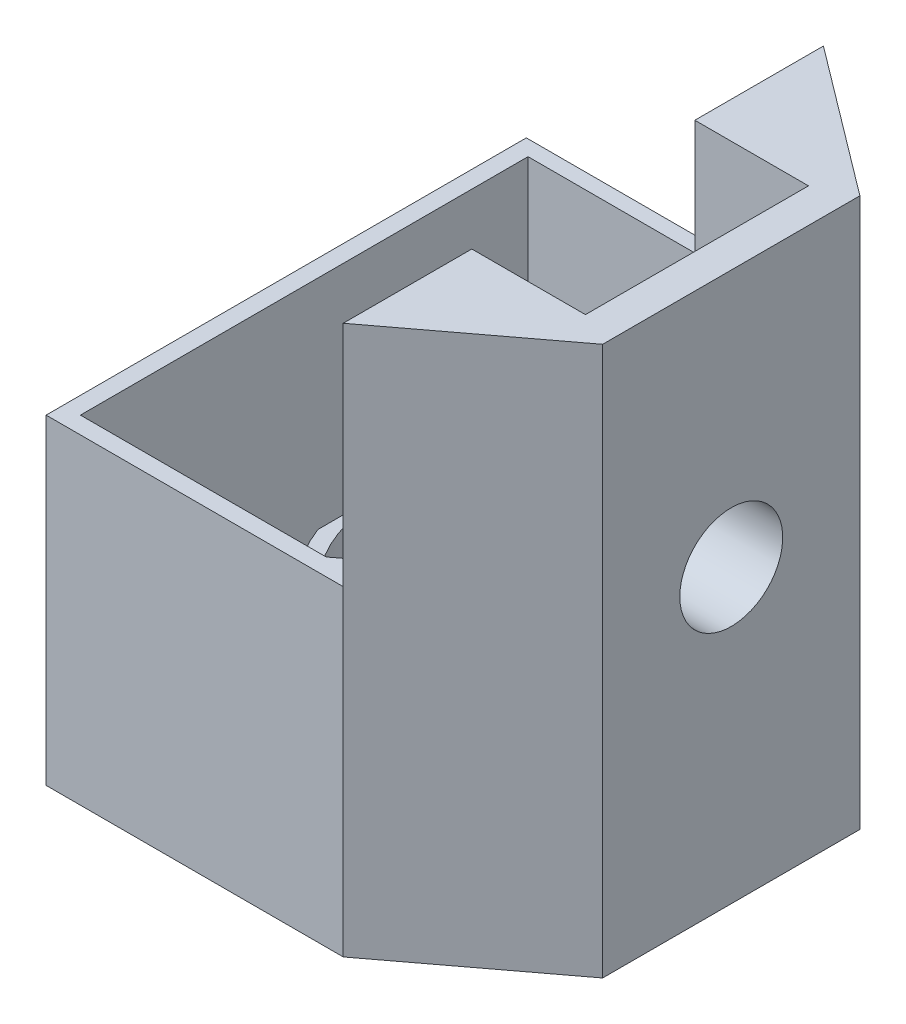
ISO-10303-21;
HEADER;
FILE_DESCRIPTION(('STEP AP214'),'2;1');
FILE_NAME('part.step','',(''),(''),'','','');
FILE_SCHEMA(('AUTOMOTIVE_DESIGN { 1 0 10303 214 1 1 1 1 }'));
ENDSEC;
DATA;
#1=APPLICATION_CONTEXT('core data for automotive mechanical design processes');
#2=APPLICATION_PROTOCOL_DEFINITION('international standard','automotive_design',2000,#1);
#3=PRODUCT_CONTEXT('',#1,'mechanical');
#4=PRODUCT('Part','Part','',(#3));
#5=PRODUCT_RELATED_PRODUCT_CATEGORY('part','',(#4));
#6=PRODUCT_DEFINITION_FORMATION('','',#4);
#7=PRODUCT_DEFINITION_CONTEXT('part definition',#1,'design');
#8=PRODUCT_DEFINITION('design','',#6,#7);
#9=PRODUCT_DEFINITION_SHAPE('','',#8);
#10=(LENGTH_UNIT() NAMED_UNIT(*) SI_UNIT(.MILLI.,.METRE.));
#11=(NAMED_UNIT(*) PLANE_ANGLE_UNIT() SI_UNIT($,.RADIAN.));
#12=(NAMED_UNIT(*) SI_UNIT($,.STERADIAN.) SOLID_ANGLE_UNIT());
#13=UNCERTAINTY_MEASURE_WITH_UNIT(LENGTH_MEASURE(1.E-05),#10,'distance_accuracy_value','');
#14=(GEOMETRIC_REPRESENTATION_CONTEXT(3) GLOBAL_UNCERTAINTY_ASSIGNED_CONTEXT((#13)) GLOBAL_UNIT_ASSIGNED_CONTEXT((#10,
#11,#12)) REPRESENTATION_CONTEXT('',''));
#15=CARTESIAN_POINT('',(0.,0.,0.));
#16=DIRECTION('',(0.,0.,1.));
#17=DIRECTION('',(1.,0.,0.));
#18=AXIS2_PLACEMENT_3D('',#15,#16,#17);
#19=CARTESIAN_POINT('',(0.,-15.,-6.50283678389311));
#20=DIRECTION('',(-0.601815023152049,0.,0.798635510047292));
#21=DIRECTION('',(0.798635510047292,0.,0.601815023152049));
#22=AXIS2_PLACEMENT_3D('',#19,#20,#21);
#23=PLANE('',#22);
#24=DIRECTION('',(0.,1.,0.));
#25=VECTOR('',#24,1.);
#26=CARTESIAN_POINT('',(0.,-15.,-6.50283678389311));
#27=LINE('',#26,#25);
#28=CARTESIAN_POINT('',(0.,-15.,-6.50283678389311));
#29=VERTEX_POINT('',#28);
#30=CARTESIAN_POINT('',(0.,1.69999999999999,-6.50283678389311));
#31=VERTEX_POINT('',#30);
#32=EDGE_CURVE('E376',#29,#31,#27,.T.);
#33=ORIENTED_EDGE('',*,*,#32,.T.);
#34=DIRECTION('',(-0.798635510047292,0.,-0.601815023152049));
#35=VECTOR('',#34,1.);
#36=CARTESIAN_POINT('',(0.,1.69999999999999,-6.50283678389311));
#37=LINE('',#36,#35);
#38=CARTESIAN_POINT('',(-6.62579134053264,1.69999999999999,-11.4957286836875));
#39=VERTEX_POINT('',#38);
#40=EDGE_CURVE('E240',#31,#39,#37,.T.);
#41=ORIENTED_EDGE('',*,*,#40,.T.);
#42=DIRECTION('',(0.798635510047292,0.,0.601815023152049));
#43=VECTOR('',#42,1.);
#44=CARTESIAN_POINT('',(0.,1.69999999999999,-6.50283678389311));
#45=LINE('',#44,#43);
#46=CARTESIAN_POINT('',(-8.75473128331924,1.69999999999999,-13.1));
#47=VERTEX_POINT('',#46);
#48=EDGE_CURVE('E294',#47,#39,#45,.T.);
#49=ORIENTED_EDGE('',*,*,#48,.F.);
#50=DIRECTION('',(0.,-1.,0.));
#51=VECTOR('',#50,1.);
#52=CARTESIAN_POINT('',(-8.75473128331924,-15.,-13.1));
#53=LINE('',#52,#51);
#54=CARTESIAN_POINT('',(-8.75473128331924,-15.,-13.1));
#55=VERTEX_POINT('',#54);
#56=EDGE_CURVE('E317',#47,#55,#53,.T.);
#57=ORIENTED_EDGE('',*,*,#56,.T.);
#58=DIRECTION('',(0.798635510047292,0.,0.601815023152049));
#59=VECTOR('',#58,1.);
#60=CARTESIAN_POINT('',(0.,-15.,-6.50283678389311));
#61=LINE('',#60,#59);
#62=EDGE_CURVE('E372',#55,#29,#61,.T.);
#63=ORIENTED_EDGE('',*,*,#62,.T.);
#64=EDGE_LOOP('',(#33,#41,#49,#57,#63));
#65=FACE_BOUND('',#64,.T.);
#66=ADVANCED_FACE('F33',(#65),#23,.T.);
#67=CARTESIAN_POINT('',(0.,-15.,6.50283678389311));
#68=DIRECTION('',(-0.601815023152049,0.,-0.798635510047292));
#69=DIRECTION('',(-0.798635510047292,0.,0.601815023152049));
#70=AXIS2_PLACEMENT_3D('',#67,#68,#69);
#71=PLANE('',#70);
#72=DIRECTION('',(-0.798635510047292,0.,0.601815023152049));
#73=VECTOR('',#72,1.);
#74=CARTESIAN_POINT('',(0.,1.69999999999999,6.50283678389311));
#75=LINE('',#74,#73);
#76=CARTESIAN_POINT('',(0.,1.69999999999998,6.50283678389311));
#77=VERTEX_POINT('',#76);
#78=CARTESIAN_POINT('',(-6.62579134053264,1.69999999999998,11.4957286836875));
#79=VERTEX_POINT('',#78);
#80=EDGE_CURVE('E254',#77,#79,#75,.T.);
#81=ORIENTED_EDGE('',*,*,#80,.F.);
#82=DIRECTION('',(0.,1.,0.));
#83=VECTOR('',#82,1.);
#84=CARTESIAN_POINT('',(0.,-15.,6.50283678389311));
#85=LINE('',#84,#83);
#86=CARTESIAN_POINT('',(0.,-15.,6.50283678389311));
#87=VERTEX_POINT('',#86);
#88=EDGE_CURVE('E364',#87,#77,#85,.T.);
#89=ORIENTED_EDGE('',*,*,#88,.F.);
#90=DIRECTION('',(-0.798635510047292,0.,0.601815023152049));
#91=VECTOR('',#90,1.);
#92=CARTESIAN_POINT('',(0.,-15.,6.50283678389311));
#93=LINE('',#92,#91);
#94=CARTESIAN_POINT('',(-8.62202680115719,-15.,13.));
#95=VERTEX_POINT('',#94);
#96=EDGE_CURVE('E361',#87,#95,#93,.T.);
#97=ORIENTED_EDGE('',*,*,#96,.T.);
#98=DIRECTION('',(0.,1.,0.));
#99=VECTOR('',#98,1.);
#100=CARTESIAN_POINT('',(-8.62202680115719,-15.,13.));
#101=LINE('',#100,#99);
#102=CARTESIAN_POINT('',(-8.62202680115719,1.69999999999999,13.));
#103=VERTEX_POINT('',#102);
#104=EDGE_CURVE('E319',#95,#103,#101,.T.);
#105=ORIENTED_EDGE('',*,*,#104,.T.);
#106=DIRECTION('',(-0.798635510047292,0.,0.601815023152049));
#107=VECTOR('',#106,1.);
#108=CARTESIAN_POINT('',(0.,1.69999999999999,6.50283678389311));
#109=LINE('',#108,#107);
#110=EDGE_CURVE('E292',#79,#103,#109,.T.);
#111=ORIENTED_EDGE('',*,*,#110,.F.);
#112=EDGE_LOOP('',(#81,#89,#97,#105,#111));
#113=FACE_BOUND('',#112,.T.);
#114=ADVANCED_FACE('F460',(#113),#71,.T.);
#115=CARTESIAN_POINT('',(0.,-15.,0.));
#116=DIRECTION('',(0.,-1.,0.));
#117=DIRECTION('',(0.,0.,-1.));
#118=AXIS2_PLACEMENT_3D('',#115,#116,#117);
#119=PLANE('',#118);
#120=DIRECTION('',(-1.,0.,0.));
#121=VECTOR('',#120,1.);
#122=CARTESIAN_POINT('',(-19.9490716227776,-15.,12.));
#123=LINE('',#122,#121);
#124=CARTESIAN_POINT('',(-9.94907162277759,-15.,12.));
#125=VERTEX_POINT('',#124);
#126=CARTESIAN_POINT('',(-19.9490716227776,-15.,12.));
#127=VERTEX_POINT('',#126);
#128=EDGE_CURVE('E208',#125,#127,#123,.T.);
#129=ORIENTED_EDGE('',*,*,#128,.T.);
#130=DIRECTION('',(0.,0.,-1.));
#131=VECTOR('',#130,1.);
#132=CARTESIAN_POINT('',(-19.9490716227776,-15.,12.));
#133=LINE('',#132,#131);
#134=CARTESIAN_POINT('',(-19.9490716227776,-15.,6.99999999999997));
#135=VERTEX_POINT('',#134);
#136=EDGE_CURVE('E202',#127,#135,#133,.T.);
#137=ORIENTED_EDGE('',*,*,#136,.T.);
#138=DIRECTION('',(1.,0.,0.));
#139=VECTOR('',#138,1.);
#140=CARTESIAN_POINT('',(-19.9490716227776,-15.,6.99999999999997));
#141=LINE('',#140,#139);
#142=CARTESIAN_POINT('',(-9.94907162277759,-15.,6.99999999999997));
#143=VERTEX_POINT('',#142);
#144=EDGE_CURVE('E211',#135,#143,#141,.T.);
#145=ORIENTED_EDGE('',*,*,#144,.T.);
#146=DIRECTION('',(0.,0.,1.));
#147=VECTOR('',#146,1.);
#148=CARTESIAN_POINT('',(-9.94907162277759,-15.,12.));
#149=LINE('',#148,#147);
#150=EDGE_CURVE('E48',#143,#125,#149,.T.);
#151=ORIENTED_EDGE('',*,*,#150,.T.);
#152=EDGE_LOOP('',(#129,#137,#145,#151));
#153=FACE_BOUND('',#152,.T.);
#154=DIRECTION('',(1.,0.,0.));
#155=VECTOR('',#154,1.);
#156=CARTESIAN_POINT('',(-6.62579134053264,-15.,-13.1));
#157=LINE('',#156,#155);
#158=CARTESIAN_POINT('',(-9.86910560364314,-15.,-13.1));
#159=VERTEX_POINT('',#158);
#160=EDGE_CURVE('E304',#159,#55,#157,.T.);
#161=ORIENTED_EDGE('',*,*,#160,.F.);
#162=CARTESIAN_POINT('',(-13.8841109013204,-15.,-4.27950229380476));
#163=DIRECTION('',(0.,-1.,0.));
#164=DIRECTION('',(0.,0.,-1.));
#165=AXIS2_PLACEMENT_3D('',#162,#163,#164);
#166=CIRCLE('',#165,9.69130782326983);
#167=CARTESIAN_POINT('',(-22.9490716227776,-15.,-0.851976299182919));
#168=VERTEX_POINT('',#167);
#169=EDGE_CURVE('E402',#168,#159,#166,.F.);
#170=ORIENTED_EDGE('',*,*,#169,.F.);
#171=DIRECTION('',(0.,0.,-1.));
#172=VECTOR('',#171,1.);
#173=CARTESIAN_POINT('',(-22.9490716227776,-15.,13.));
#174=LINE('',#173,#172);
#175=CARTESIAN_POINT('',(-22.9490716227776,-15.,13.));
#176=VERTEX_POINT('',#175);
#177=EDGE_CURVE('E301',#176,#168,#174,.T.);
#178=ORIENTED_EDGE('',*,*,#177,.F.);
#179=DIRECTION('',(-1.,0.,0.));
#180=VECTOR('',#179,1.);
#181=CARTESIAN_POINT('',(-22.9490716227776,-15.,13.));
#182=LINE('',#181,#180);
#183=EDGE_CURVE('E297',#95,#176,#182,.T.);
#184=ORIENTED_EDGE('',*,*,#183,.F.);
#185=ORIENTED_EDGE('',*,*,#96,.F.);
#186=DIRECTION('',(0.,0.,-1.));
#187=VECTOR('',#186,1.);
#188=CARTESIAN_POINT('',(0.,-15.,10.));
#189=LINE('',#188,#187);
#190=EDGE_CURVE('E390',#87,#29,#189,.T.);
#191=ORIENTED_EDGE('',*,*,#190,.T.);
#192=ORIENTED_EDGE('',*,*,#62,.F.);
#193=EDGE_LOOP('',(#161,#170,#178,#184,#185,#191,#192));
#194=FACE_BOUND('',#193,.T.);
#195=ADVANCED_FACE('F215',(#153,#194),#119,.F.);
#196=CARTESIAN_POINT('',(-22.9490716227776,-15.,-13.1));
#197=VERTEX_POINT('',#196);
#198=CARTESIAN_POINT('',(-17.8991161989976,-15.,-13.1));
#199=VERTEX_POINT('',#198);
#200=EDGE_CURVE('E305',#197,#199,#157,.T.);
#201=ORIENTED_EDGE('',*,*,#200,.F.);
#202=CARTESIAN_POINT('',(-22.9490716227776,-15.,-7.70702828842661));
#203=VERTEX_POINT('',#202);
#204=EDGE_CURVE('E300',#203,#197,#174,.T.);
#205=ORIENTED_EDGE('',*,*,#204,.F.);
#206=EDGE_CURVE('E403',#199,#203,#166,.F.);
#207=ORIENTED_EDGE('',*,*,#206,.F.);
#208=EDGE_LOOP('',(#201,#205,#207));
#209=FACE_BOUND('',#208,.T.);
#210=ADVANCED_FACE('F445',(#209),#119,.F.);
#211=CARTESIAN_POINT('',(-13.8841109013204,-11.,-4.27950229380476));
#212=DIRECTION('',(0.,1.,0.));
#213=DIRECTION('',(0.,0.,1.));
#214=AXIS2_PLACEMENT_3D('',#211,#212,#213);
#215=PLANE('',#214);
#216=CARTESIAN_POINT('',(-13.8841109013204,-11.,-4.27950229380476));
#217=DIRECTION('',(0.,1.,0.));
#218=DIRECTION('',(0.,0.,1.));
#219=AXIS2_PLACEMENT_3D('',#216,#217,#218);
#220=CIRCLE('',#219,8.81055964009286);
#221=CARTESIAN_POINT('',(-13.8841109013204,-11.,4.5310573462881));
#222=VERTEX_POINT('',#221);
#223=EDGE_CURVE('E323',#222,#222,#220,.T.);
#224=ORIENTED_EDGE('',*,*,#223,.F.);
#225=EDGE_LOOP('',(#224));
#226=FACE_BOUND('',#225,.T.);
#227=CARTESIAN_POINT('',(-13.8841109013204,-11.,-4.27950229380476));
#228=DIRECTION('',(0.,1.,0.));
#229=DIRECTION('',(0.,0.,1.));
#230=AXIS2_PLACEMENT_3D('',#227,#228,#229);
#231=CIRCLE('',#230,9.69130782326983);
#232=CARTESIAN_POINT('',(-22.9490716227776,-11.,-0.851976299182919));
#233=VERTEX_POINT('',#232);
#234=CARTESIAN_POINT('',(-9.86910560364314,-11.,-13.1));
#235=VERTEX_POINT('',#234);
#236=EDGE_CURVE('E326',#233,#235,#231,.T.);
#237=ORIENTED_EDGE('',*,*,#236,.T.);
#238=DIRECTION('',(-1.,0.,0.));
#239=VECTOR('',#238,1.);
#240=CARTESIAN_POINT('',(-13.8841109013204,-11.,-13.1));
#241=LINE('',#240,#239);
#242=CARTESIAN_POINT('',(-17.8991161989976,-11.,-13.1));
#243=VERTEX_POINT('',#242);
#244=EDGE_CURVE('E315',#235,#243,#241,.T.);
#245=ORIENTED_EDGE('',*,*,#244,.T.);
#246=CARTESIAN_POINT('',(-22.9490716227776,-11.,-7.70702828842661));
#247=VERTEX_POINT('',#246);
#248=EDGE_CURVE('E331',#243,#247,#231,.T.);
#249=ORIENTED_EDGE('',*,*,#248,.T.);
#250=DIRECTION('',(0.,0.,1.));
#251=VECTOR('',#250,1.);
#252=CARTESIAN_POINT('',(-22.9490716227776,-11.,-4.27950229380476));
#253=LINE('',#252,#251);
#254=EDGE_CURVE('E312',#247,#233,#253,.T.);
#255=ORIENTED_EDGE('',*,*,#254,.T.);
#256=EDGE_LOOP('',(#237,#245,#249,#255));
#257=FACE_BOUND('',#256,.T.);
#258=ADVANCED_FACE('F425',(#226,#257),#215,.T.);
#259=CARTESIAN_POINT('',(-13.8841109013204,-11.,-4.27950229380476));
#260=DIRECTION('',(0.,-1.,0.));
#261=DIRECTION('',(0.,0.,-1.));
#262=AXIS2_PLACEMENT_3D('',#259,#260,#261);
#263=CYLINDRICAL_SURFACE('',#262,9.69130782326983);
#264=DIRECTION('',(0.,-1.,0.));
#265=VECTOR('',#264,1.);
#266=CARTESIAN_POINT('',(-9.86910560364314,-11.,-13.1));
#267=LINE('',#266,#265);
#268=EDGE_CURVE('E41',#235,#159,#267,.T.);
#269=ORIENTED_EDGE('',*,*,#268,.F.);
#270=ORIENTED_EDGE('',*,*,#236,.F.);
#271=DIRECTION('',(0.,-1.,0.));
#272=VECTOR('',#271,1.);
#273=CARTESIAN_POINT('',(-22.9490716227776,-11.,-0.851976299182919));
#274=LINE('',#273,#272);
#275=EDGE_CURVE('E406',#168,#233,#274,.F.);
#276=ORIENTED_EDGE('',*,*,#275,.F.);
#277=ORIENTED_EDGE('',*,*,#169,.T.);
#278=EDGE_LOOP('',(#269,#270,#276,#277));
#279=FACE_BOUND('',#278,.T.);
#280=ADVANCED_FACE('F422',(#279),#263,.T.);
#281=DIRECTION('',(0.,-1.,0.));
#282=VECTOR('',#281,1.);
#283=CARTESIAN_POINT('',(-17.8991161989976,-11.,-13.1));
#284=LINE('',#283,#282);
#285=EDGE_CURVE('E412',#199,#243,#284,.F.);
#286=ORIENTED_EDGE('',*,*,#285,.F.);
#287=ORIENTED_EDGE('',*,*,#206,.T.);
#288=DIRECTION('',(0.,-1.,0.));
#289=VECTOR('',#288,1.);
#290=CARTESIAN_POINT('',(-22.9490716227776,-11.,-7.70702828842661));
#291=LINE('',#290,#289);
#292=EDGE_CURVE('E409',#247,#203,#291,.T.);
#293=ORIENTED_EDGE('',*,*,#292,.F.);
#294=ORIENTED_EDGE('',*,*,#248,.F.);
#295=EDGE_LOOP('',(#286,#287,#293,#294));
#296=FACE_BOUND('',#295,.T.);
#297=ADVANCED_FACE('F447',(#296),#263,.T.);
#298=CARTESIAN_POINT('',(0.,0.,0.));
#299=DIRECTION('',(1.,0.,0.));
#300=DIRECTION('',(0.,0.,-1.));
#301=AXIS2_PLACEMENT_3D('',#298,#299,#300);
#302=PLANE('',#301);
#303=ORIENTED_EDGE('',*,*,#190,.F.);
#304=ORIENTED_EDGE('',*,*,#88,.T.);
#305=DIRECTION('',(0.,-1.,0.));
#306=VECTOR('',#305,1.);
#307=CARTESIAN_POINT('',(0.,25.0054268863064,6.50283678389311));
#308=LINE('',#307,#306);
#309=CARTESIAN_POINT('',(0.,15.,6.50283678389311));
#310=VERTEX_POINT('',#309);
#311=EDGE_CURVE('E255',#310,#77,#308,.T.);
#312=ORIENTED_EDGE('',*,*,#311,.F.);
#313=DIRECTION('',(0.,0.,1.));
#314=VECTOR('',#313,1.);
#315=CARTESIAN_POINT('',(0.,15.,10.));
#316=LINE('',#315,#314);
#317=CARTESIAN_POINT('',(0.,15.,-6.50283678389311));
#318=VERTEX_POINT('',#317);
#319=EDGE_CURVE('E395',#318,#310,#316,.T.);
#320=ORIENTED_EDGE('',*,*,#319,.F.);
#321=DIRECTION('',(0.,-1.,0.));
#322=VECTOR('',#321,1.);
#323=CARTESIAN_POINT('',(0.,25.0054268863064,-6.50283678389311));
#324=LINE('',#323,#322);
#325=EDGE_CURVE('E246',#318,#31,#324,.T.);
#326=ORIENTED_EDGE('',*,*,#325,.T.);
#327=ORIENTED_EDGE('',*,*,#32,.F.);
#328=EDGE_LOOP('',(#303,#304,#312,#320,#326,#327));
#329=FACE_BOUND('',#328,.T.);
#330=CARTESIAN_POINT('',(0.,0.,0.));
#331=DIRECTION('',(1.,0.,0.));
#332=DIRECTION('',(0.,0.,-1.));
#333=AXIS2_PLACEMENT_3D('',#330,#331,#332);
#334=CIRCLE('',#333,5.);
#335=CARTESIAN_POINT('',(0.,0.,-5.));
#336=VERTEX_POINT('',#335);
#337=EDGE_CURVE('E394',#336,#336,#334,.F.);
#338=ORIENTED_EDGE('',*,*,#337,.F.);
#339=EDGE_LOOP('',(#338));
#340=FACE_BOUND('',#339,.T.);
#341=ADVANCED_FACE('F449',(#329,#340),#302,.F.);
#342=CARTESIAN_POINT('',(2.,15.,10.));
#343=DIRECTION('',(0.,-1.,0.));
#344=DIRECTION('',(0.,0.,-1.));
#345=AXIS2_PLACEMENT_3D('',#342,#343,#344);
#346=PLANE('',#345);
#347=DIRECTION('',(0.,0.,-1.));
#348=VECTOR('',#347,1.);
#349=CARTESIAN_POINT('',(-6.62579134053264,15.,14.));
#350=LINE('',#349,#348);
#351=CARTESIAN_POINT('',(-6.62579134053264,15.,-6.50283678389311));
#352=VERTEX_POINT('',#351);
#353=CARTESIAN_POINT('',(-6.62579134053264,15.,-14.));
#354=VERTEX_POINT('',#353);
#355=EDGE_CURVE('E284',#352,#354,#350,.T.);
#356=ORIENTED_EDGE('',*,*,#355,.F.);
#357=DIRECTION('',(-1.,0.,0.));
#358=VECTOR('',#357,1.);
#359=CARTESIAN_POINT('',(0.,15.,-6.50283678389311));
#360=LINE('',#359,#358);
#361=EDGE_CURVE('E237',#318,#352,#360,.T.);
#362=ORIENTED_EDGE('',*,*,#361,.F.);
#363=ORIENTED_EDGE('',*,*,#319,.T.);
#364=DIRECTION('',(1.,0.,0.));
#365=VECTOR('',#364,1.);
#366=CARTESIAN_POINT('',(0.,15.,6.50283678389311));
#367=LINE('',#366,#365);
#368=CARTESIAN_POINT('',(-6.62579134053264,15.,6.50283678389311));
#369=VERTEX_POINT('',#368);
#370=EDGE_CURVE('E252',#369,#310,#367,.T.);
#371=ORIENTED_EDGE('',*,*,#370,.F.);
#372=CARTESIAN_POINT('',(-6.62579134053264,15.,14.));
#373=VERTEX_POINT('',#372);
#374=EDGE_CURVE('E282',#373,#369,#350,.T.);
#375=ORIENTED_EDGE('',*,*,#374,.F.);
#376=DIRECTION('',(0.798635510047292,0.,-0.601815023152049));
#377=VECTOR('',#376,1.);
#378=CARTESIAN_POINT('',(2.,15.,7.49999999999997));
#379=LINE('',#378,#377);
#380=CARTESIAN_POINT('',(2.,15.,7.50000000000003));
#381=VERTEX_POINT('',#380);
#382=EDGE_CURVE('E360',#373,#381,#379,.T.);
#383=ORIENTED_EDGE('',*,*,#382,.T.);
#384=DIRECTION('',(0.,0.,1.));
#385=VECTOR('',#384,1.);
#386=CARTESIAN_POINT('',(2.,15.,10.));
#387=LINE('',#386,#385);
#388=CARTESIAN_POINT('',(2.,15.,-7.49999999999997));
#389=VERTEX_POINT('',#388);
#390=EDGE_CURVE('E391',#389,#381,#387,.T.);
#391=ORIENTED_EDGE('',*,*,#390,.F.);
#392=DIRECTION('',(-0.798635510047292,0.,-0.601815023152049));
#393=VECTOR('',#392,1.);
#394=CARTESIAN_POINT('',(2.,15.,-7.49999999999997));
#395=LINE('',#394,#393);
#396=EDGE_CURVE('E369',#389,#354,#395,.T.);
#397=ORIENTED_EDGE('',*,*,#396,.T.);
#398=EDGE_LOOP('',(#356,#362,#363,#371,#375,#383,#391,#397));
#399=FACE_BOUND('',#398,.T.);
#400=ADVANCED_FACE('F35',(#399),#346,.F.);
#401=CARTESIAN_POINT('',(2.,0.,0.));
#402=DIRECTION('',(1.,0.,0.));
#403=DIRECTION('',(0.,0.,-1.));
#404=AXIS2_PLACEMENT_3D('',#401,#402,#403);
#405=PLANE('',#404);
#406=DIRECTION('',(0.,1.,0.));
#407=VECTOR('',#406,1.);
#408=CARTESIAN_POINT('',(2.,-15.,-7.49999999999997));
#409=LINE('',#408,#407);
#410=CARTESIAN_POINT('',(2.,-17.,-7.49999999999997));
#411=VERTEX_POINT('',#410);
#412=EDGE_CURVE('E382',#411,#389,#409,.T.);
#413=ORIENTED_EDGE('',*,*,#412,.T.);
#414=ORIENTED_EDGE('',*,*,#390,.T.);
#415=DIRECTION('',(0.,1.,0.));
#416=VECTOR('',#415,1.);
#417=CARTESIAN_POINT('',(2.,-15.,7.50000000000003));
#418=LINE('',#417,#416);
#419=CARTESIAN_POINT('',(2.,-17.,7.50000000000003));
#420=VERTEX_POINT('',#419);
#421=EDGE_CURVE('E379',#420,#381,#418,.T.);
#422=ORIENTED_EDGE('',*,*,#421,.F.);
#423=DIRECTION('',(0.,0.,1.));
#424=VECTOR('',#423,1.);
#425=CARTESIAN_POINT('',(2.,-17.,7.50000000000003));
#426=LINE('',#425,#424);
#427=EDGE_CURVE('E345',#411,#420,#426,.T.);
#428=ORIENTED_EDGE('',*,*,#427,.F.);
#429=EDGE_LOOP('',(#413,#414,#422,#428));
#430=FACE_BOUND('',#429,.T.);
#431=CARTESIAN_POINT('',(2.,0.,0.));
#432=DIRECTION('',(-1.,0.,0.));
#433=DIRECTION('',(0.,0.,1.));
#434=AXIS2_PLACEMENT_3D('',#431,#432,#433);
#435=CIRCLE('',#434,3.);
#436=CARTESIAN_POINT('',(2.,0.,3.));
#437=VERTEX_POINT('',#436);
#438=EDGE_CURVE('E385',#437,#437,#435,.T.);
#439=ORIENTED_EDGE('',*,*,#438,.T.);
#440=EDGE_LOOP('',(#439));
#441=FACE_BOUND('',#440,.T.);
#442=ADVANCED_FACE('F482',(#430,#441),#405,.T.);
#443=CARTESIAN_POINT('',(2.,0.,0.));
#444=DIRECTION('',(-1.,0.,0.));
#445=DIRECTION('',(0.,0.,1.));
#446=AXIS2_PLACEMENT_3D('',#443,#444,#445);
#447=CYLINDRICAL_SURFACE('',#446,3.);
#448=ORIENTED_EDGE('',*,*,#438,.F.);
#449=EDGE_LOOP('',(#448));
#450=FACE_BOUND('',#449,.T.);
#451=CARTESIAN_POINT('',(-3.,0.,0.));
#452=DIRECTION('',(-1.,0.,0.));
#453=DIRECTION('',(0.,0.,1.));
#454=AXIS2_PLACEMENT_3D('',#451,#452,#453);
#455=CIRCLE('',#454,3.);
#456=CARTESIAN_POINT('',(-3.,0.,3.));
#457=VERTEX_POINT('',#456);
#458=EDGE_CURVE('E354',#457,#457,#455,.T.);
#459=ORIENTED_EDGE('',*,*,#458,.T.);
#460=EDGE_LOOP('',(#459));
#461=FACE_BOUND('',#460,.T.);
#462=ADVANCED_FACE('F475',(#450,#461),#447,.F.);
#463=CARTESIAN_POINT('',(-6.62579134053264,-15.,-14.));
#464=DIRECTION('',(0.,0.,-1.));
#465=DIRECTION('',(-1.,0.,0.));
#466=AXIS2_PLACEMENT_3D('',#463,#464,#465);
#467=PLANE('',#466);
#468=DIRECTION('',(-1.,0.,0.));
#469=VECTOR('',#468,1.);
#470=CARTESIAN_POINT('',(-16.9341109013203,1.69999999999998,-14.));
#471=LINE('',#470,#469);
#472=CARTESIAN_POINT('',(-6.62579134053264,1.69999999999999,-14.));
#473=VERTEX_POINT('',#472);
#474=CARTESIAN_POINT('',(-23.9490716227776,1.69999999999998,-14.));
#475=VERTEX_POINT('',#474);
#476=EDGE_CURVE('E265',#473,#475,#471,.T.);
#477=ORIENTED_EDGE('',*,*,#476,.F.);
#478=DIRECTION('',(0.,1.,0.));
#479=VECTOR('',#478,1.);
#480=CARTESIAN_POINT('',(-6.62579134053264,-15.,-14.));
#481=LINE('',#480,#479);
#482=CARTESIAN_POINT('',(-6.62579134053264,-17.,-14.));
#483=VERTEX_POINT('',#482);
#484=EDGE_CURVE('E374',#483,#473,#481,.T.);
#485=ORIENTED_EDGE('',*,*,#484,.F.);
#486=DIRECTION('',(1.,0.,0.));
#487=VECTOR('',#486,1.);
#488=CARTESIAN_POINT('',(-9.9490716227776,-17.,-14.));
#489=LINE('',#488,#487);
#490=CARTESIAN_POINT('',(-23.9490716227776,-17.,-14.));
#491=VERTEX_POINT('',#490);
#492=EDGE_CURVE('E338',#491,#483,#489,.T.);
#493=ORIENTED_EDGE('',*,*,#492,.F.);
#494=DIRECTION('',(0.,-1.,0.));
#495=VECTOR('',#494,1.);
#496=CARTESIAN_POINT('',(-23.9490716227776,-15.,-14.));
#497=LINE('',#496,#495);
#498=EDGE_CURVE('E336',#475,#491,#497,.T.);
#499=ORIENTED_EDGE('',*,*,#498,.F.);
#500=EDGE_LOOP('',(#477,#485,#493,#499));
#501=FACE_BOUND('',#500,.T.);
#502=ADVANCED_FACE('F471',(#501),#467,.T.);
#503=CARTESIAN_POINT('',(2.,-15.,-7.49999999999997));
#504=DIRECTION('',(0.601815023152049,0.,-0.798635510047292));
#505=DIRECTION('',(-0.798635510047292,0.,-0.601815023152049));
#506=AXIS2_PLACEMENT_3D('',#503,#504,#505);
#507=PLANE('',#506);
#508=ORIENTED_EDGE('',*,*,#484,.T.);
#509=DIRECTION('',(0.,-1.,0.));
#510=VECTOR('',#509,1.);
#511=CARTESIAN_POINT('',(-6.62579134053264,15.,-14.));
#512=LINE('',#511,#510);
#513=EDGE_CURVE('E270',#354,#473,#512,.T.);
#514=ORIENTED_EDGE('',*,*,#513,.F.);
#515=ORIENTED_EDGE('',*,*,#396,.F.);
#516=ORIENTED_EDGE('',*,*,#412,.F.);
#517=DIRECTION('',(0.798635510047292,0.,0.601815023152049));
#518=VECTOR('',#517,1.);
#519=CARTESIAN_POINT('',(-6.62579134053264,-17.,-14.));
#520=LINE('',#519,#518);
#521=EDGE_CURVE('E342',#483,#411,#520,.T.);
#522=ORIENTED_EDGE('',*,*,#521,.F.);
#523=EDGE_LOOP('',(#508,#514,#515,#516,#522));
#524=FACE_BOUND('',#523,.T.);
#525=ADVANCED_FACE('F474',(#524),#507,.T.);
#526=CARTESIAN_POINT('',(2.,-15.,7.49999999999997));
#527=DIRECTION('',(0.601815023152049,0.,0.798635510047292));
#528=DIRECTION('',(0.798635510047292,0.,-0.601815023152049));
#529=AXIS2_PLACEMENT_3D('',#526,#527,#528);
#530=PLANE('',#529);
#531=DIRECTION('',(0.,-1.,0.));
#532=VECTOR('',#531,1.);
#533=CARTESIAN_POINT('',(-6.62579134053264,15.,14.));
#534=LINE('',#533,#532);
#535=CARTESIAN_POINT('',(-6.62579134053264,1.69999999999999,14.));
#536=VERTEX_POINT('',#535);
#537=EDGE_CURVE('E269',#373,#536,#534,.T.);
#538=ORIENTED_EDGE('',*,*,#537,.T.);
#539=DIRECTION('',(0.,1.,0.));
#540=VECTOR('',#539,1.);
#541=CARTESIAN_POINT('',(-6.62579134053264,-15.,14.));
#542=LINE('',#541,#540);
#543=CARTESIAN_POINT('',(-6.62579134053264,-17.,14.));
#544=VERTEX_POINT('',#543);
#545=EDGE_CURVE('E366',#544,#536,#542,.T.);
#546=ORIENTED_EDGE('',*,*,#545,.F.);
#547=DIRECTION('',(-0.798635510047295,0.,0.601815023152046));
#548=VECTOR('',#547,1.);
#549=CARTESIAN_POINT('',(-6.62579134053264,-17.,14.));
#550=LINE('',#549,#548);
#551=EDGE_CURVE('E348',#420,#544,#550,.T.);
#552=ORIENTED_EDGE('',*,*,#551,.F.);
#553=ORIENTED_EDGE('',*,*,#421,.T.);
#554=ORIENTED_EDGE('',*,*,#382,.F.);
#555=EDGE_LOOP('',(#538,#546,#552,#553,#554));
#556=FACE_BOUND('',#555,.T.);
#557=ADVANCED_FACE('F470',(#556),#530,.T.);
#558=CARTESIAN_POINT('',(-6.62579134053264,-15.,14.));
#559=DIRECTION('',(0.,0.,1.));
#560=DIRECTION('',(1.,0.,0.));
#561=AXIS2_PLACEMENT_3D('',#558,#559,#560);
#562=PLANE('',#561);
#563=DIRECTION('',(-1.,0.,0.));
#564=VECTOR('',#563,1.);
#565=CARTESIAN_POINT('',(-16.9341109013203,1.69999999999998,14.));
#566=LINE('',#565,#564);
#567=CARTESIAN_POINT('',(-23.9490716227776,1.69999999999998,14.));
#568=VERTEX_POINT('',#567);
#569=EDGE_CURVE('E266',#536,#568,#566,.T.);
#570=ORIENTED_EDGE('',*,*,#569,.T.);
#571=DIRECTION('',(0.,-1.,0.));
#572=VECTOR('',#571,1.);
#573=CARTESIAN_POINT('',(-23.9490716227776,-15.,14.));
#574=LINE('',#573,#572);
#575=CARTESIAN_POINT('',(-23.9490716227776,-17.,14.));
#576=VERTEX_POINT('',#575);
#577=EDGE_CURVE('E335',#568,#576,#574,.T.);
#578=ORIENTED_EDGE('',*,*,#577,.T.);
#579=DIRECTION('',(-1.,0.,0.));
#580=VECTOR('',#579,1.);
#581=CARTESIAN_POINT('',(-9.9490716227776,-17.,14.));
#582=LINE('',#581,#580);
#583=EDGE_CURVE('E351',#544,#576,#582,.T.);
#584=ORIENTED_EDGE('',*,*,#583,.F.);
#585=ORIENTED_EDGE('',*,*,#545,.T.);
#586=EDGE_LOOP('',(#570,#578,#584,#585));
#587=FACE_BOUND('',#586,.T.);
#588=ADVANCED_FACE('F499',(#587),#562,.T.);
#589=CARTESIAN_POINT('',(-3.,0.,0.));
#590=DIRECTION('',(-1.,0.,0.));
#591=DIRECTION('',(0.,0.,1.));
#592=AXIS2_PLACEMENT_3D('',#589,#590,#591);
#593=PLANE('',#592);
#594=CARTESIAN_POINT('',(-3.,0.,0.));
#595=DIRECTION('',(-1.,0.,0.));
#596=DIRECTION('',(0.,0.,1.));
#597=AXIS2_PLACEMENT_3D('',#594,#595,#596);
#598=CIRCLE('',#597,5.);
#599=CARTESIAN_POINT('',(-3.,0.,5.));
#600=VERTEX_POINT('',#599);
#601=EDGE_CURVE('E357',#600,#600,#598,.T.);
#602=ORIENTED_EDGE('',*,*,#601,.T.);
#603=EDGE_LOOP('',(#602));
#604=FACE_BOUND('',#603,.T.);
#605=ORIENTED_EDGE('',*,*,#458,.F.);
#606=EDGE_LOOP('',(#605));
#607=FACE_BOUND('',#606,.T.);
#608=ADVANCED_FACE('F496',(#604,#607),#593,.T.);
#609=CARTESIAN_POINT('',(-3.,0.,0.));
#610=DIRECTION('',(1.,0.,0.));
#611=DIRECTION('',(0.,0.,-1.));
#612=AXIS2_PLACEMENT_3D('',#609,#610,#611);
#613=CYLINDRICAL_SURFACE('',#612,5.);
#614=ORIENTED_EDGE('',*,*,#601,.F.);
#615=EDGE_LOOP('',(#614));
#616=FACE_BOUND('',#615,.T.);
#617=ORIENTED_EDGE('',*,*,#337,.T.);
#618=EDGE_LOOP('',(#617));
#619=FACE_BOUND('',#618,.T.);
#620=ADVANCED_FACE('F498',(#616,#619),#613,.T.);
#621=CARTESIAN_POINT('',(0.,-17.,0.));
#622=DIRECTION('',(0.,-1.,0.));
#623=DIRECTION('',(0.,0.,-1.));
#624=AXIS2_PLACEMENT_3D('',#621,#622,#623);
#625=PLANE('',#624);
#626=DIRECTION('',(0.,0.,-1.));
#627=VECTOR('',#626,1.);
#628=CARTESIAN_POINT('',(-19.9490716227776,-17.,12.));
#629=LINE('',#628,#627);
#630=CARTESIAN_POINT('',(-19.9490716227776,-17.,12.));
#631=VERTEX_POINT('',#630);
#632=CARTESIAN_POINT('',(-19.9490716227776,-17.,6.99999999999997));
#633=VERTEX_POINT('',#632);
#634=EDGE_CURVE('E56',#631,#633,#629,.T.);
#635=ORIENTED_EDGE('',*,*,#634,.F.);
#636=DIRECTION('',(-1.,0.,0.));
#637=VECTOR('',#636,1.);
#638=CARTESIAN_POINT('',(-19.9490716227776,-17.,12.));
#639=LINE('',#638,#637);
#640=CARTESIAN_POINT('',(-9.94907162277759,-17.,12.));
#641=VERTEX_POINT('',#640);
#642=EDGE_CURVE('E218',#641,#631,#639,.T.);
#643=ORIENTED_EDGE('',*,*,#642,.F.);
#644=DIRECTION('',(0.,0.,1.));
#645=VECTOR('',#644,1.);
#646=CARTESIAN_POINT('',(-9.94907162277759,-17.,12.));
#647=LINE('',#646,#645);
#648=CARTESIAN_POINT('',(-9.94907162277759,-17.,6.99999999999997));
#649=VERTEX_POINT('',#648);
#650=EDGE_CURVE('E221',#649,#641,#647,.T.);
#651=ORIENTED_EDGE('',*,*,#650,.F.);
#652=DIRECTION('',(1.,0.,0.));
#653=VECTOR('',#652,1.);
#654=CARTESIAN_POINT('',(-19.9490716227776,-17.,6.99999999999997));
#655=LINE('',#654,#653);
#656=EDGE_CURVE('E227',#633,#649,#655,.T.);
#657=ORIENTED_EDGE('',*,*,#656,.F.);
#658=EDGE_LOOP('',(#635,#643,#651,#657));
#659=FACE_BOUND('',#658,.T.);
#660=ORIENTED_EDGE('',*,*,#583,.T.);
#661=DIRECTION('',(0.,0.,-1.));
#662=VECTOR('',#661,1.);
#663=CARTESIAN_POINT('',(-23.9490716227776,-17.,-14.));
#664=LINE('',#663,#662);
#665=EDGE_CURVE('E332',#576,#491,#664,.T.);
#666=ORIENTED_EDGE('',*,*,#665,.T.);
#667=ORIENTED_EDGE('',*,*,#492,.T.);
#668=ORIENTED_EDGE('',*,*,#521,.T.);
#669=ORIENTED_EDGE('',*,*,#427,.T.);
#670=ORIENTED_EDGE('',*,*,#551,.T.);
#671=EDGE_LOOP('',(#660,#666,#667,#668,#669,#670));
#672=FACE_BOUND('',#671,.T.);
#673=ADVANCED_FACE('F505',(#659,#672),#625,.T.);
#674=CARTESIAN_POINT('',(-23.9490716227776,-15.,-14.));
#675=DIRECTION('',(-1.,0.,0.));
#676=DIRECTION('',(0.,0.,1.));
#677=AXIS2_PLACEMENT_3D('',#674,#675,#676);
#678=PLANE('',#677);
#679=DIRECTION('',(0.,0.,-1.));
#680=VECTOR('',#679,1.);
#681=CARTESIAN_POINT('',(-23.9490716227776,1.69999999999998,14.));
#682=LINE('',#681,#680);
#683=EDGE_CURVE('E273',#568,#475,#682,.T.);
#684=ORIENTED_EDGE('',*,*,#683,.T.);
#685=ORIENTED_EDGE('',*,*,#498,.T.);
#686=ORIENTED_EDGE('',*,*,#665,.F.);
#687=ORIENTED_EDGE('',*,*,#577,.F.);
#688=EDGE_LOOP('',(#684,#685,#686,#687));
#689=FACE_BOUND('',#688,.T.);
#690=ADVANCED_FACE('F516',(#689),#678,.T.);
#691=CARTESIAN_POINT('',(-13.8841109013204,-11.,-4.27950229380476));
#692=DIRECTION('',(0.,-1.,0.));
#693=DIRECTION('',(0.,0.,-1.));
#694=AXIS2_PLACEMENT_3D('',#691,#692,#693);
#695=CYLINDRICAL_SURFACE('',#694,8.81055964009286);
#696=ORIENTED_EDGE('',*,*,#223,.T.);
#697=EDGE_LOOP('',(#696));
#698=FACE_BOUND('',#697,.T.);
#699=CARTESIAN_POINT('',(-13.8841109013204,-15.,-4.27950229380476));
#700=DIRECTION('',(0.,1.,0.));
#701=DIRECTION('',(0.,0.,1.));
#702=AXIS2_PLACEMENT_3D('',#699,#700,#701);
#703=CIRCLE('',#702,8.81055964009286);
#704=CARTESIAN_POINT('',(-13.8841109013204,-15.,4.5310573462881));
#705=VERTEX_POINT('',#704);
#706=EDGE_CURVE('E322',#705,#705,#703,.T.);
#707=ORIENTED_EDGE('',*,*,#706,.F.);
#708=EDGE_LOOP('',(#707));
#709=FACE_BOUND('',#708,.T.);
#710=ADVANCED_FACE('F519',(#698,#709),#695,.F.);
#711=ORIENTED_EDGE('',*,*,#706,.T.);
#712=EDGE_LOOP('',(#711));
#713=FACE_BOUND('',#712,.T.);
#714=ADVANCED_FACE('F514',(#713),#119,.F.);
#715=CARTESIAN_POINT('',(-6.62579134053264,47.9256137336453,-13.1));
#716=DIRECTION('',(0.,0.,-1.));
#717=DIRECTION('',(-1.,0.,0.));
#718=AXIS2_PLACEMENT_3D('',#715,#716,#717);
#719=PLANE('',#718);
#720=ORIENTED_EDGE('',*,*,#56,.F.);
#721=DIRECTION('',(-1.,0.,0.));
#722=VECTOR('',#721,1.);
#723=CARTESIAN_POINT('',(-6.62579134053264,1.69999999999999,-13.1));
#724=LINE('',#723,#722);
#725=CARTESIAN_POINT('',(-22.9490716227776,1.69999999999999,-13.1));
#726=VERTEX_POINT('',#725);
#727=EDGE_CURVE('E289',#47,#726,#724,.T.);
#728=ORIENTED_EDGE('',*,*,#727,.T.);
#729=DIRECTION('',(0.,-1.,0.));
#730=VECTOR('',#729,1.);
#731=CARTESIAN_POINT('',(-22.9490716227776,47.9256137336453,-13.1));
#732=LINE('',#731,#730);
#733=EDGE_CURVE('E308',#726,#197,#732,.T.);
#734=ORIENTED_EDGE('',*,*,#733,.T.);
#735=ORIENTED_EDGE('',*,*,#200,.T.);
#736=ORIENTED_EDGE('',*,*,#285,.T.);
#737=ORIENTED_EDGE('',*,*,#244,.F.);
#738=ORIENTED_EDGE('',*,*,#268,.T.);
#739=ORIENTED_EDGE('',*,*,#160,.T.);
#740=EDGE_LOOP('',(#720,#728,#734,#735,#736,#737,#738,#739));
#741=FACE_BOUND('',#740,.T.);
#742=ADVANCED_FACE('F419',(#741),#719,.F.);
#743=CARTESIAN_POINT('',(-22.9490716227776,47.9256137336453,13.));
#744=DIRECTION('',(-1.,0.,0.));
#745=DIRECTION('',(0.,0.,1.));
#746=AXIS2_PLACEMENT_3D('',#743,#744,#745);
#747=PLANE('',#746);
#748=ORIENTED_EDGE('',*,*,#733,.F.);
#749=DIRECTION('',(0.,0.,1.));
#750=VECTOR('',#749,1.);
#751=CARTESIAN_POINT('',(-22.9490716227776,1.69999999999999,13.));
#752=LINE('',#751,#750);
#753=CARTESIAN_POINT('',(-22.9490716227776,1.69999999999999,13.));
#754=VERTEX_POINT('',#753);
#755=EDGE_CURVE('E280',#726,#754,#752,.T.);
#756=ORIENTED_EDGE('',*,*,#755,.T.);
#757=DIRECTION('',(0.,-1.,0.));
#758=VECTOR('',#757,1.);
#759=CARTESIAN_POINT('',(-22.9490716227776,47.9256137336453,13.));
#760=LINE('',#759,#758);
#761=EDGE_CURVE('E310',#754,#176,#760,.T.);
#762=ORIENTED_EDGE('',*,*,#761,.T.);
#763=ORIENTED_EDGE('',*,*,#177,.T.);
#764=ORIENTED_EDGE('',*,*,#275,.T.);
#765=ORIENTED_EDGE('',*,*,#254,.F.);
#766=ORIENTED_EDGE('',*,*,#292,.T.);
#767=ORIENTED_EDGE('',*,*,#204,.T.);
#768=EDGE_LOOP('',(#748,#756,#762,#763,#764,#765,#766,#767));
#769=FACE_BOUND('',#768,.T.);
#770=ADVANCED_FACE('F431',(#769),#747,.F.);
#771=CARTESIAN_POINT('',(-22.9490716227776,47.9256137336453,13.));
#772=DIRECTION('',(0.,0.,1.));
#773=DIRECTION('',(1.,0.,0.));
#774=AXIS2_PLACEMENT_3D('',#771,#772,#773);
#775=PLANE('',#774);
#776=ORIENTED_EDGE('',*,*,#761,.F.);
#777=DIRECTION('',(1.,0.,0.));
#778=VECTOR('',#777,1.);
#779=CARTESIAN_POINT('',(-22.9490716227776,1.69999999999999,13.));
#780=LINE('',#779,#778);
#781=EDGE_CURVE('E11',#754,#103,#780,.T.);
#782=ORIENTED_EDGE('',*,*,#781,.T.);
#783=ORIENTED_EDGE('',*,*,#104,.F.);
#784=ORIENTED_EDGE('',*,*,#183,.T.);
#785=EDGE_LOOP('',(#776,#782,#783,#784));
#786=FACE_BOUND('',#785,.T.);
#787=ADVANCED_FACE('F570',(#786),#775,.F.);
#788=CARTESIAN_POINT('',(-6.62579134053264,15.,14.));
#789=DIRECTION('',(1.,0.,0.));
#790=DIRECTION('',(0.,0.,-1.));
#791=AXIS2_PLACEMENT_3D('',#788,#789,#790);
#792=PLANE('',#791);
#793=DIRECTION('',(0.,0.,-1.));
#794=VECTOR('',#793,1.);
#795=CARTESIAN_POINT('',(-6.62579134053264,1.69999999999999,14.));
#796=LINE('',#795,#794);
#797=EDGE_CURVE('E281',#39,#473,#796,.T.);
#798=ORIENTED_EDGE('',*,*,#797,.F.);
#799=DIRECTION('',(0.,0.,1.));
#800=VECTOR('',#799,1.);
#801=CARTESIAN_POINT('',(-6.62579134053264,1.69999999999998,-6.50283678389311));
#802=LINE('',#801,#800);
#803=CARTESIAN_POINT('',(-6.62579134053264,1.69999999999998,-6.50283678389311));
#804=VERTEX_POINT('',#803);
#805=EDGE_CURVE('E233',#39,#804,#802,.T.);
#806=ORIENTED_EDGE('',*,*,#805,.T.);
#807=DIRECTION('',(0.,-1.,0.));
#808=VECTOR('',#807,1.);
#809=CARTESIAN_POINT('',(-6.62579134053264,25.0054268863064,-6.50283678389311));
#810=LINE('',#809,#808);
#811=EDGE_CURVE('E241',#352,#804,#810,.T.);
#812=ORIENTED_EDGE('',*,*,#811,.F.);
#813=ORIENTED_EDGE('',*,*,#355,.T.);
#814=ORIENTED_EDGE('',*,*,#513,.T.);
#815=EDGE_LOOP('',(#798,#806,#812,#813,#814));
#816=FACE_BOUND('',#815,.T.);
#817=ADVANCED_FACE('F566',(#816),#792,.F.);
#818=ORIENTED_EDGE('',*,*,#374,.T.);
#819=DIRECTION('',(0.,-1.,0.));
#820=VECTOR('',#819,1.);
#821=CARTESIAN_POINT('',(-6.62579134053264,25.0054268863064,6.50283678389311));
#822=LINE('',#821,#820);
#823=CARTESIAN_POINT('',(-6.62579134053264,1.69999999999998,6.50283678389311));
#824=VERTEX_POINT('',#823);
#825=EDGE_CURVE('E261',#369,#824,#822,.T.);
#826=ORIENTED_EDGE('',*,*,#825,.T.);
#827=DIRECTION('',(0.,0.,1.));
#828=VECTOR('',#827,1.);
#829=CARTESIAN_POINT('',(-6.62579134053264,1.69999999999998,14.));
#830=LINE('',#829,#828);
#831=EDGE_CURVE('E258',#824,#79,#830,.T.);
#832=ORIENTED_EDGE('',*,*,#831,.T.);
#833=EDGE_CURVE('E277',#536,#79,#796,.T.);
#834=ORIENTED_EDGE('',*,*,#833,.F.);
#835=ORIENTED_EDGE('',*,*,#537,.F.);
#836=EDGE_LOOP('',(#818,#826,#832,#834,#835));
#837=FACE_BOUND('',#836,.T.);
#838=ADVANCED_FACE('F542',(#837),#792,.F.);
#839=CARTESIAN_POINT('',(-16.9341109013203,1.69999999999998,14.));
#840=DIRECTION('',(0.,-1.,0.));
#841=DIRECTION('',(0.,0.,-1.));
#842=AXIS2_PLACEMENT_3D('',#839,#840,#841);
#843=PLANE('',#842);
#844=ORIENTED_EDGE('',*,*,#48,.T.);
#845=ORIENTED_EDGE('',*,*,#797,.T.);
#846=ORIENTED_EDGE('',*,*,#476,.T.);
#847=ORIENTED_EDGE('',*,*,#683,.F.);
#848=ORIENTED_EDGE('',*,*,#569,.F.);
#849=ORIENTED_EDGE('',*,*,#833,.T.);
#850=ORIENTED_EDGE('',*,*,#110,.T.);
#851=ORIENTED_EDGE('',*,*,#781,.F.);
#852=ORIENTED_EDGE('',*,*,#755,.F.);
#853=ORIENTED_EDGE('',*,*,#727,.F.);
#854=EDGE_LOOP('',(#844,#845,#846,#847,#848,#849,#850,#851,#852,#853));
#855=FACE_BOUND('',#854,.T.);
#856=ADVANCED_FACE('F536',(#855),#843,.F.);
#857=CARTESIAN_POINT('',(0.,1.69999999999998,0.));
#858=DIRECTION('',(0.,-1.,0.));
#859=DIRECTION('',(0.,0.,-1.));
#860=AXIS2_PLACEMENT_3D('',#857,#858,#859);
#861=PLANE('',#860);
#862=DIRECTION('',(-1.,0.,0.));
#863=VECTOR('',#862,1.);
#864=CARTESIAN_POINT('',(0.,1.69999999999998,6.50283678389311));
#865=LINE('',#864,#863);
#866=EDGE_CURVE('E251',#77,#824,#865,.T.);
#867=ORIENTED_EDGE('',*,*,#866,.F.);
#868=ORIENTED_EDGE('',*,*,#80,.T.);
#869=ORIENTED_EDGE('',*,*,#831,.F.);
#870=EDGE_LOOP('',(#867,#868,#869));
#871=FACE_BOUND('',#870,.T.);
#872=ADVANCED_FACE('F552',(#871),#861,.T.);
#873=CARTESIAN_POINT('',(0.,25.0054268863064,6.50283678389311));
#874=DIRECTION('',(0.,0.,1.));
#875=DIRECTION('',(1.,0.,0.));
#876=AXIS2_PLACEMENT_3D('',#873,#874,#875);
#877=PLANE('',#876);
#878=ORIENTED_EDGE('',*,*,#825,.F.);
#879=ORIENTED_EDGE('',*,*,#370,.T.);
#880=ORIENTED_EDGE('',*,*,#311,.T.);
#881=ORIENTED_EDGE('',*,*,#866,.T.);
#882=EDGE_LOOP('',(#878,#879,#880,#881));
#883=FACE_BOUND('',#882,.T.);
#884=ADVANCED_FACE('F548',(#883),#877,.F.);
#885=CARTESIAN_POINT('',(0.,1.69999999999998,0.));
#886=DIRECTION('',(0.,1.,0.));
#887=DIRECTION('',(0.,0.,1.));
#888=AXIS2_PLACEMENT_3D('',#885,#886,#887);
#889=PLANE('',#888);
#890=ORIENTED_EDGE('',*,*,#40,.F.);
#891=DIRECTION('',(1.,0.,0.));
#892=VECTOR('',#891,1.);
#893=CARTESIAN_POINT('',(0.,1.69999999999998,-6.50283678389311));
#894=LINE('',#893,#892);
#895=EDGE_CURVE('E243',#804,#31,#894,.T.);
#896=ORIENTED_EDGE('',*,*,#895,.F.);
#897=ORIENTED_EDGE('',*,*,#805,.F.);
#898=EDGE_LOOP('',(#890,#896,#897));
#899=FACE_BOUND('',#898,.T.);
#900=ADVANCED_FACE('F563',(#899),#889,.F.);
#901=CARTESIAN_POINT('',(0.,25.0054268863064,-6.50283678389311));
#902=DIRECTION('',(0.,0.,-1.));
#903=DIRECTION('',(-1.,0.,0.));
#904=AXIS2_PLACEMENT_3D('',#901,#902,#903);
#905=PLANE('',#904);
#906=ORIENTED_EDGE('',*,*,#325,.F.);
#907=ORIENTED_EDGE('',*,*,#361,.T.);
#908=ORIENTED_EDGE('',*,*,#811,.T.);
#909=ORIENTED_EDGE('',*,*,#895,.T.);
#910=EDGE_LOOP('',(#906,#907,#908,#909));
#911=FACE_BOUND('',#910,.T.);
#912=ADVANCED_FACE('F558',(#911),#905,.F.);
#913=CARTESIAN_POINT('',(-19.9490716227776,-15.,12.));
#914=DIRECTION('',(-1.,0.,0.));
#915=DIRECTION('',(0.,0.,1.));
#916=AXIS2_PLACEMENT_3D('',#913,#914,#915);
#917=PLANE('',#916);
#918=ORIENTED_EDGE('',*,*,#634,.T.);
#919=DIRECTION('',(0.,-1.,0.));
#920=VECTOR('',#919,1.);
#921=CARTESIAN_POINT('',(-19.9490716227776,-15.,6.99999999999997));
#922=LINE('',#921,#920);
#923=EDGE_CURVE('E198',#135,#633,#922,.T.);
#924=ORIENTED_EDGE('',*,*,#923,.F.);
#925=ORIENTED_EDGE('',*,*,#136,.F.);
#926=DIRECTION('',(0.,-1.,0.));
#927=VECTOR('',#926,1.);
#928=CARTESIAN_POINT('',(-19.9490716227776,-15.,12.));
#929=LINE('',#928,#927);
#930=EDGE_CURVE('E231',#127,#631,#929,.T.);
#931=ORIENTED_EDGE('',*,*,#930,.T.);
#932=EDGE_LOOP('',(#918,#924,#925,#931));
#933=FACE_BOUND('',#932,.T.);
#934=ADVANCED_FACE('F200',(#933),#917,.F.);
#935=CARTESIAN_POINT('',(-19.9490716227776,-15.,12.));
#936=DIRECTION('',(0.,0.,1.));
#937=DIRECTION('',(1.,0.,0.));
#938=AXIS2_PLACEMENT_3D('',#935,#936,#937);
#939=PLANE('',#938);
#940=ORIENTED_EDGE('',*,*,#642,.T.);
#941=ORIENTED_EDGE('',*,*,#930,.F.);
#942=ORIENTED_EDGE('',*,*,#128,.F.);
#943=DIRECTION('',(0.,-1.,0.));
#944=VECTOR('',#943,1.);
#945=CARTESIAN_POINT('',(-9.94907162277759,-15.,12.));
#946=LINE('',#945,#944);
#947=EDGE_CURVE('E234',#125,#641,#946,.T.);
#948=ORIENTED_EDGE('',*,*,#947,.T.);
#949=EDGE_LOOP('',(#940,#941,#942,#948));
#950=FACE_BOUND('',#949,.T.);
#951=ADVANCED_FACE('F710',(#950),#939,.F.);
#952=CARTESIAN_POINT('',(-9.94907162277759,-15.,12.));
#953=DIRECTION('',(1.,0.,0.));
#954=DIRECTION('',(0.,0.,-1.));
#955=AXIS2_PLACEMENT_3D('',#952,#953,#954);
#956=PLANE('',#955);
#957=ORIENTED_EDGE('',*,*,#650,.T.);
#958=ORIENTED_EDGE('',*,*,#947,.F.);
#959=ORIENTED_EDGE('',*,*,#150,.F.);
#960=DIRECTION('',(0.,-1.,0.));
#961=VECTOR('',#960,1.);
#962=CARTESIAN_POINT('',(-9.94907162277759,-15.,6.99999999999997));
#963=LINE('',#962,#961);
#964=EDGE_CURVE('E207',#143,#649,#963,.T.);
#965=ORIENTED_EDGE('',*,*,#964,.T.);
#966=EDGE_LOOP('',(#957,#958,#959,#965));
#967=FACE_BOUND('',#966,.T.);
#968=ADVANCED_FACE('F718',(#967),#956,.F.);
#969=CARTESIAN_POINT('',(-19.9490716227776,-15.,6.99999999999997));
#970=DIRECTION('',(0.,0.,-1.));
#971=DIRECTION('',(-1.,0.,0.));
#972=AXIS2_PLACEMENT_3D('',#969,#970,#971);
#973=PLANE('',#972);
#974=ORIENTED_EDGE('',*,*,#656,.T.);
#975=ORIENTED_EDGE('',*,*,#964,.F.);
#976=ORIENTED_EDGE('',*,*,#144,.F.);
#977=ORIENTED_EDGE('',*,*,#923,.T.);
#978=EDGE_LOOP('',(#974,#975,#976,#977));
#979=FACE_BOUND('',#978,.T.);
#980=ADVANCED_FACE('F212',(#979),#973,.F.);
#981=CLOSED_SHELL('',(#66,#114,#195,#210,#258,#280,#297,#341,#400,#442,#462,#502,#525,#557,#588,
#608,#620,#673,#690,#710,#714,#742,#770,#787,#817,#838,#856,#872,#884,#900,#912,#934,#951,#968,#980));
#982=MANIFOLD_SOLID_BREP('B2',#981);
#983=ADVANCED_BREP_SHAPE_REPRESENTATION('',(#18,#982),#14);
#984=SHAPE_DEFINITION_REPRESENTATION(#9,#983);
ENDSEC;
END-ISO-10303-21;
